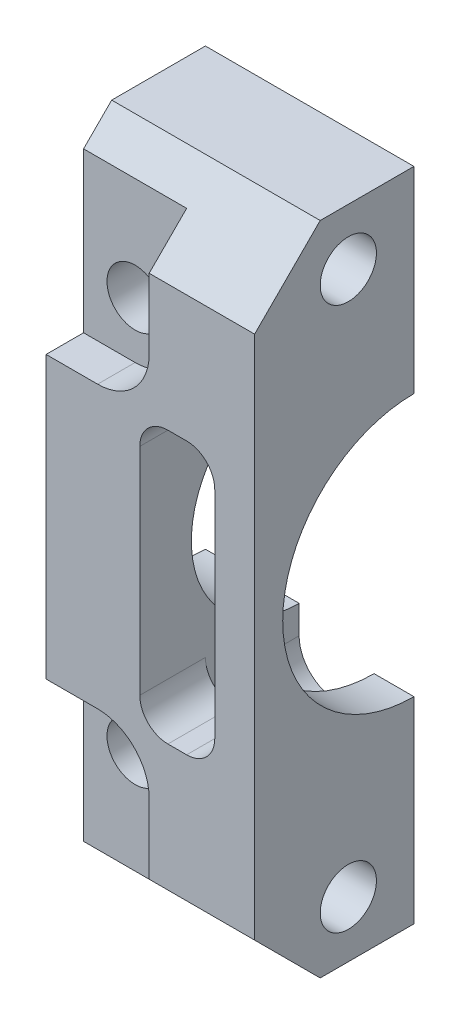
ISO-10303-21;
HEADER;
FILE_DESCRIPTION(('STEP AP214'),'2;1');
FILE_NAME('part.step','',(''),(''),'','','');
FILE_SCHEMA(('AUTOMOTIVE_DESIGN { 1 0 10303 214 1 1 1 1 }'));
ENDSEC;
DATA;
#1=APPLICATION_CONTEXT('core data for automotive mechanical design processes');
#2=APPLICATION_PROTOCOL_DEFINITION('international standard','automotive_design',2000,#1);
#3=PRODUCT_CONTEXT('',#1,'mechanical');
#4=PRODUCT('Part','Part','',(#3));
#5=PRODUCT_RELATED_PRODUCT_CATEGORY('part','',(#4));
#6=PRODUCT_DEFINITION_FORMATION('','',#4);
#7=PRODUCT_DEFINITION_CONTEXT('part definition',#1,'design');
#8=PRODUCT_DEFINITION('design','',#6,#7);
#9=PRODUCT_DEFINITION_SHAPE('','',#8);
#10=(LENGTH_UNIT() NAMED_UNIT(*) SI_UNIT(.MILLI.,.METRE.));
#11=(NAMED_UNIT(*) PLANE_ANGLE_UNIT() SI_UNIT($,.RADIAN.));
#12=(NAMED_UNIT(*) SI_UNIT($,.STERADIAN.) SOLID_ANGLE_UNIT());
#13=UNCERTAINTY_MEASURE_WITH_UNIT(LENGTH_MEASURE(1.E-05),#10,'distance_accuracy_value','');
#14=(GEOMETRIC_REPRESENTATION_CONTEXT(3) GLOBAL_UNCERTAINTY_ASSIGNED_CONTEXT((#13)) GLOBAL_UNIT_ASSIGNED_CONTEXT((#10,
#11,#12)) REPRESENTATION_CONTEXT('',''));
#15=CARTESIAN_POINT('',(0.,0.,0.));
#16=DIRECTION('',(0.,0.,1.));
#17=DIRECTION('',(1.,0.,0.));
#18=AXIS2_PLACEMENT_3D('',#15,#16,#17);
#19=CARTESIAN_POINT('',(10.,0.,0.));
#20=DIRECTION('',(1.,0.,0.));
#21=DIRECTION('',(0.,0.,-1.));
#22=AXIS2_PLACEMENT_3D('',#19,#20,#21);
#23=PLANE('',#22);
#24=DIRECTION('',(0.,0.,-1.));
#25=VECTOR('',#24,1.);
#26=CARTESIAN_POINT('',(10.,14.5,10.));
#27=LINE('',#26,#25);
#28=CARTESIAN_POINT('',(10.,14.5,10.));
#29=VERTEX_POINT('',#28);
#30=CARTESIAN_POINT('',(10.,14.5,0.));
#31=VERTEX_POINT('',#30);
#32=EDGE_CURVE('E502',#29,#31,#27,.T.);
#33=ORIENTED_EDGE('',*,*,#32,.F.);
#34=DIRECTION('',(0.,-1.,0.));
#35=VECTOR('',#34,1.);
#36=CARTESIAN_POINT('',(10.,-14.5,9.99999999999999));
#37=LINE('',#36,#35);
#38=CARTESIAN_POINT('',(10.,11.5,10.));
#39=VERTEX_POINT('',#38);
#40=EDGE_CURVE('E350',#29,#39,#37,.T.);
#41=ORIENTED_EDGE('',*,*,#40,.T.);
#42=DIRECTION('',(0.,0.,-1.));
#43=VECTOR('',#42,1.);
#44=CARTESIAN_POINT('',(10.,11.5,0.));
#45=LINE('',#44,#43);
#46=CARTESIAN_POINT('',(10.,11.5,17.));
#47=VERTEX_POINT('',#46);
#48=EDGE_CURVE('E348',#39,#47,#45,.F.);
#49=ORIENTED_EDGE('',*,*,#48,.T.);
#50=DIRECTION('',(0.,1.,0.));
#51=VECTOR('',#50,1.);
#52=CARTESIAN_POINT('',(10.,45.,17.));
#53=LINE('',#52,#51);
#54=CARTESIAN_POINT('',(10.,-11.5,17.));
#55=VERTEX_POINT('',#54);
#56=EDGE_CURVE('E471',#55,#47,#53,.T.);
#57=ORIENTED_EDGE('',*,*,#56,.F.);
#58=DIRECTION('',(0.,0.,-1.));
#59=VECTOR('',#58,1.);
#60=CARTESIAN_POINT('',(10.,-11.5,0.));
#61=LINE('',#60,#59);
#62=CARTESIAN_POINT('',(10.,-11.5,9.99999999999999));
#63=VERTEX_POINT('',#62);
#64=EDGE_CURVE('E345',#55,#63,#61,.T.);
#65=ORIENTED_EDGE('',*,*,#64,.T.);
#66=DIRECTION('',(0.,-1.,0.));
#67=VECTOR('',#66,1.);
#68=CARTESIAN_POINT('',(10.,-14.5,9.99999999999999));
#69=LINE('',#68,#67);
#70=CARTESIAN_POINT('',(10.,-14.5,9.99999999999999));
#71=VERTEX_POINT('',#70);
#72=EDGE_CURVE('E343',#63,#71,#69,.T.);
#73=ORIENTED_EDGE('',*,*,#72,.T.);
#74=DIRECTION('',(0.,0.,-1.));
#75=VECTOR('',#74,1.);
#76=CARTESIAN_POINT('',(10.,-14.5,9.99999999999999));
#77=LINE('',#76,#75);
#78=CARTESIAN_POINT('',(10.,-14.5,0.));
#79=VERTEX_POINT('',#78);
#80=EDGE_CURVE('E488',#71,#79,#77,.T.);
#81=ORIENTED_EDGE('',*,*,#80,.T.);
#82=DIRECTION('',(0.,1.,0.));
#83=VECTOR('',#82,1.);
#84=CARTESIAN_POINT('',(10.,-11.5,0.));
#85=LINE('',#84,#83);
#86=CARTESIAN_POINT('',(10.,-11.5,0.));
#87=VERTEX_POINT('',#86);
#88=EDGE_CURVE('E298',#79,#87,#85,.T.);
#89=ORIENTED_EDGE('',*,*,#88,.T.);
#90=CARTESIAN_POINT('',(10.,0.,0.));
#91=DIRECTION('',(-1.,0.,0.));
#92=DIRECTION('',(0.,0.,-1.));
#93=AXIS2_PLACEMENT_3D('',#90,#91,#92);
#94=CIRCLE('',#93,11.5);
#95=CARTESIAN_POINT('',(10.,11.5,0.));
#96=VERTEX_POINT('',#95);
#97=EDGE_CURVE('E293',#87,#96,#94,.T.);
#98=ORIENTED_EDGE('',*,*,#97,.T.);
#99=DIRECTION('',(0.,1.,0.));
#100=VECTOR('',#99,1.);
#101=CARTESIAN_POINT('',(10.,11.5,0.));
#102=LINE('',#101,#100);
#103=EDGE_CURVE('E295',#96,#31,#102,.T.);
#104=ORIENTED_EDGE('',*,*,#103,.T.);
#105=EDGE_LOOP('',(#33,#41,#49,#57,#65,#73,#81,#89,#98,#104));
#106=FACE_BOUND('',#105,.T.);
#107=ADVANCED_FACE('F39',(#106),#23,.T.);
#108=CARTESIAN_POINT('',(10.,0.,0.));
#109=DIRECTION('',(-1.,0.,0.));
#110=DIRECTION('',(0.,0.,1.));
#111=AXIS2_PLACEMENT_3D('',#108,#109,#110);
#112=CYLINDRICAL_SURFACE('',#111,11.5);
#113=CARTESIAN_POINT('',(0.,0.,0.));
#114=DIRECTION('',(-1.,0.,0.));
#115=DIRECTION('',(0.,0.,-1.));
#116=AXIS2_PLACEMENT_3D('',#113,#114,#115);
#117=CIRCLE('',#116,11.5);
#118=CARTESIAN_POINT('',(0.,-11.5,0.));
#119=VERTEX_POINT('',#118);
#120=CARTESIAN_POINT('',(0.,11.5,0.));
#121=VERTEX_POINT('',#120);
#122=EDGE_CURVE('E292',#119,#121,#117,.T.);
#123=ORIENTED_EDGE('',*,*,#122,.T.);
#124=DIRECTION('',(-1.,0.,0.));
#125=VECTOR('',#124,1.);
#126=CARTESIAN_POINT('',(10.,11.5,0.));
#127=LINE('',#126,#125);
#128=EDGE_CURVE('E319',#96,#121,#127,.T.);
#129=ORIENTED_EDGE('',*,*,#128,.F.);
#130=ORIENTED_EDGE('',*,*,#97,.F.);
#131=DIRECTION('',(-1.,0.,0.));
#132=VECTOR('',#131,1.);
#133=CARTESIAN_POINT('',(10.,-11.5,0.));
#134=LINE('',#133,#132);
#135=EDGE_CURVE('E300',#87,#119,#134,.T.);
#136=ORIENTED_EDGE('',*,*,#135,.T.);
#137=EDGE_LOOP('',(#123,#129,#130,#136));
#138=FACE_BOUND('',#137,.T.);
#139=ADVANCED_FACE('F530',(#138),#112,.F.);
#140=CARTESIAN_POINT('',(10.,11.5,0.));
#141=DIRECTION('',(0.,0.,1.));
#142=DIRECTION('',(0.,-1.,0.));
#143=AXIS2_PLACEMENT_3D('',#140,#141,#142);
#144=PLANE('',#143);
#145=CARTESIAN_POINT('',(5.5,21.,0.));
#146=DIRECTION('',(0.,0.,-1.));
#147=DIRECTION('',(0.,1.,0.));
#148=AXIS2_PLACEMENT_3D('',#145,#146,#147);
#149=CIRCLE('',#148,3.);
#150=CARTESIAN_POINT('',(5.5,24.,0.));
#151=VERTEX_POINT('',#150);
#152=EDGE_CURVE('E381',#151,#151,#149,.T.);
#153=ORIENTED_EDGE('',*,*,#152,.F.);
#154=EDGE_LOOP('',(#153));
#155=FACE_BOUND('',#154,.T.);
#156=DIRECTION('',(-1.,0.,0.));
#157=VECTOR('',#156,1.);
#158=CARTESIAN_POINT('',(22.25,14.,0.));
#159=LINE('',#158,#157);
#160=CARTESIAN_POINT('',(22.25,14.,0.));
#161=VERTEX_POINT('',#160);
#162=CARTESIAN_POINT('',(18.,14.,0.));
#163=VERTEX_POINT('',#162);
#164=EDGE_CURVE('E289',#161,#163,#159,.T.);
#165=ORIENTED_EDGE('',*,*,#164,.T.);
#166=DIRECTION('',(0.,-1.,0.));
#167=VECTOR('',#166,1.);
#168=CARTESIAN_POINT('',(18.,-14.5,0.));
#169=LINE('',#168,#167);
#170=CARTESIAN_POINT('',(18.,14.5,0.));
#171=VERTEX_POINT('',#170);
#172=EDGE_CURVE('E485',#171,#163,#169,.T.);
#173=ORIENTED_EDGE('',*,*,#172,.F.);
#174=CARTESIAN_POINT('',(14.,14.5,0.));
#175=DIRECTION('',(0.,0.,-1.));
#176=DIRECTION('',(0.,1.,0.));
#177=AXIS2_PLACEMENT_3D('',#174,#175,#176);
#178=CIRCLE('',#177,4.);
#179=EDGE_CURVE('E491',#31,#171,#178,.T.);
#180=ORIENTED_EDGE('',*,*,#179,.F.);
#181=ORIENTED_EDGE('',*,*,#103,.F.);
#182=ORIENTED_EDGE('',*,*,#128,.T.);
#183=DIRECTION('',(0.,1.,0.));
#184=VECTOR('',#183,1.);
#185=CARTESIAN_POINT('',(0.,11.5,0.));
#186=LINE('',#185,#184);
#187=CARTESIAN_POINT('',(0.,35.,0.));
#188=VERTEX_POINT('',#187);
#189=EDGE_CURVE('E303',#121,#188,#186,.T.);
#190=ORIENTED_EDGE('',*,*,#189,.T.);
#191=DIRECTION('',(-1.,0.,0.));
#192=VECTOR('',#191,1.);
#193=CARTESIAN_POINT('',(10.,35.,0.));
#194=LINE('',#193,#192);
#195=CARTESIAN_POINT('',(22.25,35.,0.));
#196=VERTEX_POINT('',#195);
#197=EDGE_CURVE('E316',#196,#188,#194,.T.);
#198=ORIENTED_EDGE('',*,*,#197,.F.);
#199=DIRECTION('',(0.,1.,0.));
#200=VECTOR('',#199,1.);
#201=CARTESIAN_POINT('',(22.25,35.,0.));
#202=LINE('',#201,#200);
#203=EDGE_CURVE('E270',#161,#196,#202,.T.);
#204=ORIENTED_EDGE('',*,*,#203,.F.);
#205=EDGE_LOOP('',(#165,#173,#180,#181,#182,#190,#198,#204));
#206=FACE_BOUND('',#205,.T.);
#207=ADVANCED_FACE('F432',(#155,#206),#144,.F.);
#208=CARTESIAN_POINT('',(10.,35.,25.));
#209=DIRECTION('',(0.,-1.,0.));
#210=DIRECTION('',(0.,0.,-1.));
#211=AXIS2_PLACEMENT_3D('',#208,#209,#210);
#212=PLANE('',#211);
#213=DIRECTION('',(0.,0.,1.));
#214=VECTOR('',#213,1.);
#215=CARTESIAN_POINT('',(0.,35.,25.));
#216=LINE('',#215,#214);
#217=CARTESIAN_POINT('',(0.,35.,10.));
#218=VERTEX_POINT('',#217);
#219=EDGE_CURVE('E305',#188,#218,#216,.T.);
#220=ORIENTED_EDGE('',*,*,#219,.T.);
#221=DIRECTION('',(1.,0.,0.));
#222=VECTOR('',#221,1.);
#223=CARTESIAN_POINT('',(10.,35.,10.));
#224=LINE('',#223,#222);
#225=CARTESIAN_POINT('',(22.25,35.,10.));
#226=VERTEX_POINT('',#225);
#227=EDGE_CURVE('E417',#218,#226,#224,.T.);
#228=ORIENTED_EDGE('',*,*,#227,.T.);
#229=DIRECTION('',(0.,0.,1.));
#230=VECTOR('',#229,1.);
#231=CARTESIAN_POINT('',(22.25,35.,25.));
#232=LINE('',#231,#230);
#233=EDGE_CURVE('E279',#196,#226,#232,.T.);
#234=ORIENTED_EDGE('',*,*,#233,.F.);
#235=ORIENTED_EDGE('',*,*,#197,.T.);
#236=EDGE_LOOP('',(#220,#228,#234,#235));
#237=FACE_BOUND('',#236,.T.);
#238=ADVANCED_FACE('F422',(#237),#212,.F.);
#239=CARTESIAN_POINT('',(10.,-35.,0.));
#240=DIRECTION('',(0.,1.,0.));
#241=DIRECTION('',(0.,0.,1.));
#242=AXIS2_PLACEMENT_3D('',#239,#240,#241);
#243=PLANE('',#242);
#244=DIRECTION('',(0.,0.,-1.));
#245=VECTOR('',#244,1.);
#246=CARTESIAN_POINT('',(22.25,-35.,0.));
#247=LINE('',#246,#245);
#248=CARTESIAN_POINT('',(22.25,-35.,9.99999999999997));
#249=VERTEX_POINT('',#248);
#250=CARTESIAN_POINT('',(22.25,-35.,0.));
#251=VERTEX_POINT('',#250);
#252=EDGE_CURVE('E282',#249,#251,#247,.T.);
#253=ORIENTED_EDGE('',*,*,#252,.F.);
#254=DIRECTION('',(-1.,0.,0.));
#255=VECTOR('',#254,1.);
#256=CARTESIAN_POINT('',(10.,-35.,9.99999999999997));
#257=LINE('',#256,#255);
#258=CARTESIAN_POINT('',(0.,-35.,9.99999999999997));
#259=VERTEX_POINT('',#258);
#260=EDGE_CURVE('E408',#249,#259,#257,.T.);
#261=ORIENTED_EDGE('',*,*,#260,.T.);
#262=DIRECTION('',(0.,0.,-1.));
#263=VECTOR('',#262,1.);
#264=CARTESIAN_POINT('',(0.,-35.,0.));
#265=LINE('',#264,#263);
#266=CARTESIAN_POINT('',(0.,-35.,0.));
#267=VERTEX_POINT('',#266);
#268=EDGE_CURVE('E308',#259,#267,#265,.T.);
#269=ORIENTED_EDGE('',*,*,#268,.T.);
#270=DIRECTION('',(-1.,0.,0.));
#271=VECTOR('',#270,1.);
#272=CARTESIAN_POINT('',(10.,-35.,0.));
#273=LINE('',#272,#271);
#274=EDGE_CURVE('E313',#251,#267,#273,.T.);
#275=ORIENTED_EDGE('',*,*,#274,.F.);
#276=EDGE_LOOP('',(#253,#261,#269,#275));
#277=FACE_BOUND('',#276,.T.);
#278=ADVANCED_FACE('F549',(#277),#243,.F.);
#279=CARTESIAN_POINT('',(10.,-11.5,0.));
#280=DIRECTION('',(0.,0.,1.));
#281=DIRECTION('',(0.,-1.,0.));
#282=AXIS2_PLACEMENT_3D('',#279,#280,#281);
#283=PLANE('',#282);
#284=CARTESIAN_POINT('',(5.5,-21.,0.));
#285=DIRECTION('',(0.,0.,-1.));
#286=DIRECTION('',(0.,1.,0.));
#287=AXIS2_PLACEMENT_3D('',#284,#285,#286);
#288=CIRCLE('',#287,3.);
#289=CARTESIAN_POINT('',(5.5,-18.,0.));
#290=VERTEX_POINT('',#289);
#291=EDGE_CURVE('E457',#290,#290,#288,.T.);
#292=ORIENTED_EDGE('',*,*,#291,.F.);
#293=EDGE_LOOP('',(#292));
#294=FACE_BOUND('',#293,.T.);
#295=CARTESIAN_POINT('',(14.,-14.5,0.));
#296=DIRECTION('',(0.,0.,-1.));
#297=DIRECTION('',(0.,1.,0.));
#298=AXIS2_PLACEMENT_3D('',#295,#296,#297);
#299=CIRCLE('',#298,4.);
#300=CARTESIAN_POINT('',(18.,-14.5,0.));
#301=VERTEX_POINT('',#300);
#302=EDGE_CURVE('E480',#301,#79,#299,.T.);
#303=ORIENTED_EDGE('',*,*,#302,.F.);
#304=CARTESIAN_POINT('',(18.,-14.,0.));
#305=VERTEX_POINT('',#304);
#306=EDGE_CURVE('E494',#305,#301,#169,.T.);
#307=ORIENTED_EDGE('',*,*,#306,.F.);
#308=DIRECTION('',(-1.,0.,0.));
#309=VECTOR('',#308,1.);
#310=CARTESIAN_POINT('',(22.25,-14.,0.));
#311=LINE('',#310,#309);
#312=CARTESIAN_POINT('',(22.25,-14.,0.));
#313=VERTEX_POINT('',#312);
#314=EDGE_CURVE('E286',#313,#305,#311,.T.);
#315=ORIENTED_EDGE('',*,*,#314,.F.);
#316=DIRECTION('',(0.,1.,0.));
#317=VECTOR('',#316,1.);
#318=CARTESIAN_POINT('',(22.25,-14.,0.));
#319=LINE('',#318,#317);
#320=EDGE_CURVE('E284',#251,#313,#319,.T.);
#321=ORIENTED_EDGE('',*,*,#320,.F.);
#322=ORIENTED_EDGE('',*,*,#274,.T.);
#323=DIRECTION('',(0.,1.,0.));
#324=VECTOR('',#323,1.);
#325=CARTESIAN_POINT('',(0.,-11.5,0.));
#326=LINE('',#325,#324);
#327=EDGE_CURVE('E296',#267,#119,#326,.T.);
#328=ORIENTED_EDGE('',*,*,#327,.T.);
#329=ORIENTED_EDGE('',*,*,#135,.F.);
#330=ORIENTED_EDGE('',*,*,#88,.F.);
#331=EDGE_LOOP('',(#303,#307,#315,#321,#322,#328,#329,#330));
#332=FACE_BOUND('',#331,.T.);
#333=ADVANCED_FACE('F545',(#294,#332),#283,.F.);
#334=CARTESIAN_POINT('',(0.,0.,0.));
#335=DIRECTION('',(1.,0.,0.));
#336=DIRECTION('',(0.,0.,-1.));
#337=AXIS2_PLACEMENT_3D('',#334,#335,#336);
#338=PLANE('',#337);
#339=CARTESIAN_POINT('',(0.,-29.,6.99999999999999));
#340=DIRECTION('',(1.,0.,0.));
#341=DIRECTION('',(0.,0.,-1.));
#342=AXIS2_PLACEMENT_3D('',#339,#340,#341);
#343=CIRCLE('',#342,3.);
#344=CARTESIAN_POINT('',(0.,-29.,3.99999999999999));
#345=VERTEX_POINT('',#344);
#346=EDGE_CURVE('E267',#345,#345,#343,.T.);
#347=ORIENTED_EDGE('',*,*,#346,.T.);
#348=EDGE_LOOP('',(#347));
#349=FACE_BOUND('',#348,.T.);
#350=CARTESIAN_POINT('',(0.,29.,6.99999999999999));
#351=DIRECTION('',(1.,0.,0.));
#352=DIRECTION('',(0.,0.,-1.));
#353=AXIS2_PLACEMENT_3D('',#350,#351,#352);
#354=CIRCLE('',#353,3.);
#355=CARTESIAN_POINT('',(0.,29.,3.99999999999999));
#356=VERTEX_POINT('',#355);
#357=EDGE_CURVE('E273',#356,#356,#354,.T.);
#358=ORIENTED_EDGE('',*,*,#357,.T.);
#359=EDGE_LOOP('',(#358));
#360=FACE_BOUND('',#359,.T.);
#361=ORIENTED_EDGE('',*,*,#268,.F.);
#362=DIRECTION('',(0.,-0.707106781186545,-0.70710678118655));
#363=VECTOR('',#362,1.);
#364=CARTESIAN_POINT('',(0.,-28.,17.));
#365=LINE('',#364,#363);
#366=CARTESIAN_POINT('',(0.,-32.,13.));
#367=VERTEX_POINT('',#366);
#368=EDGE_CURVE('E412',#259,#367,#365,.F.);
#369=ORIENTED_EDGE('',*,*,#368,.T.);
#370=DIRECTION('',(0.,-1.,0.));
#371=VECTOR('',#370,1.);
#372=CARTESIAN_POINT('',(0.,-35.,13.));
#373=LINE('',#372,#371);
#374=CARTESIAN_POINT('',(0.,-15.,13.));
#375=VERTEX_POINT('',#374);
#376=EDGE_CURVE('E259',#375,#367,#373,.T.);
#377=ORIENTED_EDGE('',*,*,#376,.F.);
#378=DIRECTION('',(0.,0.,-1.));
#379=VECTOR('',#378,1.);
#380=CARTESIAN_POINT('',(0.,-15.,17.));
#381=LINE('',#380,#379);
#382=CARTESIAN_POINT('',(0.,-15.,17.));
#383=VERTEX_POINT('',#382);
#384=EDGE_CURVE('E242',#383,#375,#381,.T.);
#385=ORIENTED_EDGE('',*,*,#384,.F.);
#386=DIRECTION('',(0.,-1.,0.));
#387=VECTOR('',#386,1.);
#388=CARTESIAN_POINT('',(0.,45.,17.));
#389=LINE('',#388,#387);
#390=CARTESIAN_POINT('',(0.,15.,17.));
#391=VERTEX_POINT('',#390);
#392=EDGE_CURVE('E258',#391,#383,#389,.T.);
#393=ORIENTED_EDGE('',*,*,#392,.F.);
#394=DIRECTION('',(0.,0.,1.));
#395=VECTOR('',#394,1.);
#396=CARTESIAN_POINT('',(0.,15.,17.));
#397=LINE('',#396,#395);
#398=CARTESIAN_POINT('',(0.,15.,13.));
#399=VERTEX_POINT('',#398);
#400=EDGE_CURVE('E451',#399,#391,#397,.T.);
#401=ORIENTED_EDGE('',*,*,#400,.F.);
#402=DIRECTION('',(0.,-1.,0.));
#403=VECTOR('',#402,1.);
#404=CARTESIAN_POINT('',(0.,35.,13.));
#405=LINE('',#404,#403);
#406=CARTESIAN_POINT('',(0.,32.,13.));
#407=VERTEX_POINT('',#406);
#408=EDGE_CURVE('E436',#407,#399,#405,.T.);
#409=ORIENTED_EDGE('',*,*,#408,.F.);
#410=DIRECTION('',(0.,-0.707106781186549,0.707106781186546));
#411=VECTOR('',#410,1.);
#412=CARTESIAN_POINT('',(0.,35.,10.));
#413=LINE('',#412,#411);
#414=EDGE_CURVE('E410',#407,#218,#413,.F.);
#415=ORIENTED_EDGE('',*,*,#414,.T.);
#416=ORIENTED_EDGE('',*,*,#219,.F.);
#417=ORIENTED_EDGE('',*,*,#189,.F.);
#418=ORIENTED_EDGE('',*,*,#122,.F.);
#419=ORIENTED_EDGE('',*,*,#327,.F.);
#420=EDGE_LOOP('',(#361,#369,#377,#385,#393,#401,#409,#415,#416,#417,#418,#419));
#421=FACE_BOUND('',#420,.T.);
#422=ADVANCED_FACE('F256',(#349,#360,#421),#338,.F.);
#423=CARTESIAN_POINT('',(22.25,0.,0.));
#424=DIRECTION('',(-1.,0.,0.));
#425=DIRECTION('',(0.,0.,1.));
#426=AXIS2_PLACEMENT_3D('',#423,#424,#425);
#427=CYLINDRICAL_SURFACE('',#426,14.);
#428=ORIENTED_EDGE('',*,*,#314,.T.);
#429=CARTESIAN_POINT('',(18.,0.,0.));
#430=DIRECTION('',(1.,0.,0.));
#431=DIRECTION('',(0.,0.,-1.));
#432=AXIS2_PLACEMENT_3D('',#429,#430,#431);
#433=CIRCLE('',#432,14.);
#434=EDGE_CURVE('E325',#305,#163,#433,.F.);
#435=ORIENTED_EDGE('',*,*,#434,.T.);
#436=ORIENTED_EDGE('',*,*,#164,.F.);
#437=CARTESIAN_POINT('',(22.25,0.,0.));
#438=DIRECTION('',(-1.,0.,0.));
#439=DIRECTION('',(0.,0.,-1.));
#440=AXIS2_PLACEMENT_3D('',#437,#438,#439);
#441=CIRCLE('',#440,14.);
#442=EDGE_CURVE('E266',#313,#161,#441,.T.);
#443=ORIENTED_EDGE('',*,*,#442,.F.);
#444=EDGE_LOOP('',(#428,#435,#436,#443));
#445=FACE_BOUND('',#444,.T.);
#446=ADVANCED_FACE('F541',(#445),#427,.F.);
#447=CARTESIAN_POINT('',(22.25,0.,0.));
#448=DIRECTION('',(1.,0.,0.));
#449=DIRECTION('',(0.,0.,-1.));
#450=AXIS2_PLACEMENT_3D('',#447,#448,#449);
#451=PLANE('',#450);
#452=CARTESIAN_POINT('',(22.25,-29.,6.99999999999999));
#453=DIRECTION('',(1.,0.,0.));
#454=DIRECTION('',(0.,0.,-1.));
#455=AXIS2_PLACEMENT_3D('',#452,#453,#454);
#456=CIRCLE('',#455,3.);
#457=CARTESIAN_POINT('',(22.25,-29.,3.99999999999999));
#458=VERTEX_POINT('',#457);
#459=EDGE_CURVE('E507',#458,#458,#456,.T.);
#460=ORIENTED_EDGE('',*,*,#459,.F.);
#461=EDGE_LOOP('',(#460));
#462=FACE_BOUND('',#461,.T.);
#463=CARTESIAN_POINT('',(22.25,29.,6.99999999999999));
#464=DIRECTION('',(1.,0.,0.));
#465=DIRECTION('',(0.,0.,-1.));
#466=AXIS2_PLACEMENT_3D('',#463,#464,#465);
#467=CIRCLE('',#466,3.);
#468=CARTESIAN_POINT('',(22.25,29.,3.99999999999999));
#469=VERTEX_POINT('',#468);
#470=EDGE_CURVE('E499',#469,#469,#467,.T.);
#471=ORIENTED_EDGE('',*,*,#470,.F.);
#472=EDGE_LOOP('',(#471));
#473=FACE_BOUND('',#472,.T.);
#474=DIRECTION('',(0.,1.,0.));
#475=VECTOR('',#474,1.);
#476=CARTESIAN_POINT('',(22.25,0.,17.));
#477=LINE('',#476,#475);
#478=CARTESIAN_POINT('',(22.25,-28.,17.));
#479=VERTEX_POINT('',#478);
#480=CARTESIAN_POINT('',(22.25,28.,17.));
#481=VERTEX_POINT('',#480);
#482=EDGE_CURVE('E322',#479,#481,#477,.T.);
#483=ORIENTED_EDGE('',*,*,#482,.F.);
#484=DIRECTION('',(0.,0.707106781186545,0.70710678118655));
#485=VECTOR('',#484,1.);
#486=CARTESIAN_POINT('',(22.25,-22.5000000000001,22.5));
#487=LINE('',#486,#485);
#488=EDGE_CURVE('E406',#479,#249,#487,.F.);
#489=ORIENTED_EDGE('',*,*,#488,.T.);
#490=ORIENTED_EDGE('',*,*,#252,.T.);
#491=ORIENTED_EDGE('',*,*,#320,.T.);
#492=ORIENTED_EDGE('',*,*,#442,.T.);
#493=ORIENTED_EDGE('',*,*,#203,.T.);
#494=ORIENTED_EDGE('',*,*,#233,.T.);
#495=DIRECTION('',(0.,0.707106781186549,-0.707106781186546));
#496=VECTOR('',#495,1.);
#497=CARTESIAN_POINT('',(22.25,22.4999999999999,22.5));
#498=LINE('',#497,#496);
#499=EDGE_CURVE('E404',#226,#481,#498,.F.);
#500=ORIENTED_EDGE('',*,*,#499,.T.);
#501=EDGE_LOOP('',(#483,#489,#490,#491,#492,#493,#494,#500));
#502=FACE_BOUND('',#501,.T.);
#503=ADVANCED_FACE('F428',(#462,#473,#502),#451,.T.);
#504=CARTESIAN_POINT('',(0.,45.,17.));
#505=DIRECTION('',(0.,0.,-1.));
#506=DIRECTION('',(-1.,0.,0.));
#507=AXIS2_PLACEMENT_3D('',#504,#505,#506);
#508=PLANE('',#507);
#509=ORIENTED_EDGE('',*,*,#56,.T.);
#510=CARTESIAN_POINT('',(13.,11.5,17.));
#511=DIRECTION('',(0.,0.,-1.));
#512=DIRECTION('',(-1.,0.,0.));
#513=AXIS2_PLACEMENT_3D('',#510,#511,#512);
#514=CIRCLE('',#513,3.);
#515=CARTESIAN_POINT('',(13.,14.5,17.));
#516=VERTEX_POINT('',#515);
#517=EDGE_CURVE('E364',#47,#516,#514,.T.);
#518=ORIENTED_EDGE('',*,*,#517,.T.);
#519=DIRECTION('',(1.,0.,0.));
#520=VECTOR('',#519,1.);
#521=CARTESIAN_POINT('',(0.,14.5,17.));
#522=LINE('',#521,#520);
#523=CARTESIAN_POINT('',(15.,14.5,17.));
#524=VERTEX_POINT('',#523);
#525=EDGE_CURVE('E477',#516,#524,#522,.T.);
#526=ORIENTED_EDGE('',*,*,#525,.T.);
#527=CARTESIAN_POINT('',(15.,11.5,17.));
#528=DIRECTION('',(0.,0.,-1.));
#529=DIRECTION('',(-1.,0.,0.));
#530=AXIS2_PLACEMENT_3D('',#527,#528,#529);
#531=CIRCLE('',#530,3.);
#532=CARTESIAN_POINT('',(18.,11.5,17.));
#533=VERTEX_POINT('',#532);
#534=EDGE_CURVE('E360',#524,#533,#531,.T.);
#535=ORIENTED_EDGE('',*,*,#534,.T.);
#536=DIRECTION('',(0.,-1.,0.));
#537=VECTOR('',#536,1.);
#538=CARTESIAN_POINT('',(18.,45.,17.));
#539=LINE('',#538,#537);
#540=CARTESIAN_POINT('',(18.,-11.5,17.));
#541=VERTEX_POINT('',#540);
#542=EDGE_CURVE('E474',#533,#541,#539,.T.);
#543=ORIENTED_EDGE('',*,*,#542,.T.);
#544=CARTESIAN_POINT('',(15.,-11.5,17.));
#545=DIRECTION('',(0.,0.,-1.));
#546=DIRECTION('',(-1.,0.,0.));
#547=AXIS2_PLACEMENT_3D('',#544,#545,#546);
#548=CIRCLE('',#547,3.);
#549=CARTESIAN_POINT('',(15.,-14.5,17.));
#550=VERTEX_POINT('',#549);
#551=EDGE_CURVE('E372',#541,#550,#548,.T.);
#552=ORIENTED_EDGE('',*,*,#551,.T.);
#553=DIRECTION('',(-1.,0.,0.));
#554=VECTOR('',#553,1.);
#555=CARTESIAN_POINT('',(0.,-14.5,17.));
#556=LINE('',#555,#554);
#557=CARTESIAN_POINT('',(13.,-14.5,17.));
#558=VERTEX_POINT('',#557);
#559=EDGE_CURVE('E468',#550,#558,#556,.T.);
#560=ORIENTED_EDGE('',*,*,#559,.T.);
#561=CARTESIAN_POINT('',(13.,-11.5,17.));
#562=DIRECTION('',(0.,0.,-1.));
#563=DIRECTION('',(-1.,0.,0.));
#564=AXIS2_PLACEMENT_3D('',#561,#562,#563);
#565=CIRCLE('',#564,3.);
#566=EDGE_CURVE('E368',#558,#55,#565,.T.);
#567=ORIENTED_EDGE('',*,*,#566,.T.);
#568=EDGE_LOOP('',(#509,#518,#526,#535,#543,#552,#560,#567));
#569=FACE_BOUND('',#568,.T.);
#570=DIRECTION('',(0.,1.,0.));
#571=VECTOR('',#570,1.);
#572=CARTESIAN_POINT('',(11.,-35.,17.));
#573=LINE('',#572,#571);
#574=CARTESIAN_POINT('',(11.,-28.,17.));
#575=VERTEX_POINT('',#574);
#576=CARTESIAN_POINT('',(11.,-20.5,17.));
#577=VERTEX_POINT('',#576);
#578=EDGE_CURVE('E600',#575,#577,#573,.T.);
#579=ORIENTED_EDGE('',*,*,#578,.F.);
#580=DIRECTION('',(1.,0.,0.));
#581=VECTOR('',#580,1.);
#582=CARTESIAN_POINT('',(0.,-28.,17.));
#583=LINE('',#582,#581);
#584=EDGE_CURVE('E401',#575,#479,#583,.T.);
#585=ORIENTED_EDGE('',*,*,#584,.T.);
#586=ORIENTED_EDGE('',*,*,#482,.T.);
#587=DIRECTION('',(-1.,0.,0.));
#588=VECTOR('',#587,1.);
#589=CARTESIAN_POINT('',(0.,28.,17.));
#590=LINE('',#589,#588);
#591=CARTESIAN_POINT('',(11.,28.,17.));
#592=VERTEX_POINT('',#591);
#593=EDGE_CURVE('E399',#481,#592,#590,.T.);
#594=ORIENTED_EDGE('',*,*,#593,.T.);
#595=DIRECTION('',(0.,1.,0.));
#596=VECTOR('',#595,1.);
#597=CARTESIAN_POINT('',(11.,35.,17.));
#598=LINE('',#597,#596);
#599=CARTESIAN_POINT('',(11.,20.5,17.));
#600=VERTEX_POINT('',#599);
#601=EDGE_CURVE('E448',#600,#592,#598,.T.);
#602=ORIENTED_EDGE('',*,*,#601,.F.);
#603=CARTESIAN_POINT('',(5.5,20.5,17.));
#604=DIRECTION('',(0.,0.,-1.));
#605=DIRECTION('',(-1.,0.,0.));
#606=AXIS2_PLACEMENT_3D('',#603,#604,#605);
#607=CIRCLE('',#606,5.5);
#608=CARTESIAN_POINT('',(5.5,15.,17.));
#609=VERTEX_POINT('',#608);
#610=EDGE_CURVE('E397',#600,#609,#607,.T.);
#611=ORIENTED_EDGE('',*,*,#610,.T.);
#612=DIRECTION('',(-1.,0.,0.));
#613=VECTOR('',#612,1.);
#614=CARTESIAN_POINT('',(11.,15.,17.));
#615=LINE('',#614,#613);
#616=EDGE_CURVE('E260',#609,#391,#615,.T.);
#617=ORIENTED_EDGE('',*,*,#616,.T.);
#618=ORIENTED_EDGE('',*,*,#392,.T.);
#619=DIRECTION('',(-1.,0.,0.));
#620=VECTOR('',#619,1.);
#621=CARTESIAN_POINT('',(11.,-15.,17.));
#622=LINE('',#621,#620);
#623=CARTESIAN_POINT('',(5.5,-15.,17.));
#624=VERTEX_POINT('',#623);
#625=EDGE_CURVE('E238',#624,#383,#622,.T.);
#626=ORIENTED_EDGE('',*,*,#625,.F.);
#627=CARTESIAN_POINT('',(5.5,-20.5,17.));
#628=DIRECTION('',(0.,0.,-1.));
#629=DIRECTION('',(-1.,0.,0.));
#630=AXIS2_PLACEMENT_3D('',#627,#628,#629);
#631=CIRCLE('',#630,5.5);
#632=EDGE_CURVE('E395',#624,#577,#631,.T.);
#633=ORIENTED_EDGE('',*,*,#632,.T.);
#634=EDGE_LOOP('',(#579,#585,#586,#594,#602,#611,#617,#618,#626,#633));
#635=FACE_BOUND('',#634,.T.);
#636=ADVANCED_FACE('F263',(#569,#635),#508,.F.);
#637=CARTESIAN_POINT('',(-2.75,29.,6.99999999999999));
#638=DIRECTION('',(1.,0.,0.));
#639=DIRECTION('',(0.,0.,-1.));
#640=AXIS2_PLACEMENT_3D('',#637,#638,#639);
#641=CYLINDRICAL_SURFACE('',#640,3.);
#642=ORIENTED_EDGE('',*,*,#470,.T.);
#643=EDGE_LOOP('',(#642));
#644=FACE_BOUND('',#643,.T.);
#645=ORIENTED_EDGE('',*,*,#357,.F.);
#646=EDGE_LOOP('',(#645));
#647=FACE_BOUND('',#646,.T.);
#648=ADVANCED_FACE('F515',(#644,#647),#641,.F.);
#649=CARTESIAN_POINT('',(-2.75,-29.,6.99999999999999));
#650=DIRECTION('',(1.,0.,0.));
#651=DIRECTION('',(0.,0.,-1.));
#652=AXIS2_PLACEMENT_3D('',#649,#650,#651);
#653=CYLINDRICAL_SURFACE('',#652,3.);
#654=ORIENTED_EDGE('',*,*,#459,.T.);
#655=EDGE_LOOP('',(#654));
#656=FACE_BOUND('',#655,.T.);
#657=ORIENTED_EDGE('',*,*,#346,.F.);
#658=EDGE_LOOP('',(#657));
#659=FACE_BOUND('',#658,.T.);
#660=ADVANCED_FACE('F517',(#656,#659),#653,.F.);
#661=CARTESIAN_POINT('',(14.,-14.5,9.99999999999999));
#662=DIRECTION('',(0.,0.,-1.));
#663=DIRECTION('',(0.,1.,0.));
#664=AXIS2_PLACEMENT_3D('',#661,#662,#663);
#665=PLANE('',#664);
#666=DIRECTION('',(1.,0.,0.));
#667=VECTOR('',#666,1.);
#668=CARTESIAN_POINT('',(18.,14.5,10.));
#669=LINE('',#668,#667);
#670=CARTESIAN_POINT('',(13.,14.5,10.));
#671=VERTEX_POINT('',#670);
#672=CARTESIAN_POINT('',(15.,14.5,10.));
#673=VERTEX_POINT('',#672);
#674=EDGE_CURVE('E465',#671,#673,#669,.T.);
#675=ORIENTED_EDGE('',*,*,#674,.F.);
#676=CARTESIAN_POINT('',(13.,11.5,10.));
#677=DIRECTION('',(0.,0.,-1.));
#678=DIRECTION('',(0.,1.,0.));
#679=AXIS2_PLACEMENT_3D('',#676,#677,#678);
#680=CIRCLE('',#679,3.);
#681=EDGE_CURVE('E362',#671,#39,#680,.F.);
#682=ORIENTED_EDGE('',*,*,#681,.T.);
#683=ORIENTED_EDGE('',*,*,#40,.F.);
#684=CARTESIAN_POINT('',(14.,14.5,10.));
#685=DIRECTION('',(0.,0.,-1.));
#686=DIRECTION('',(0.,1.,0.));
#687=AXIS2_PLACEMENT_3D('',#684,#685,#686);
#688=CIRCLE('',#687,4.);
#689=CARTESIAN_POINT('',(18.,14.5,10.));
#690=VERTEX_POINT('',#689);
#691=EDGE_CURVE('E484',#29,#690,#688,.T.);
#692=ORIENTED_EDGE('',*,*,#691,.T.);
#693=DIRECTION('',(0.,1.,0.));
#694=VECTOR('',#693,1.);
#695=CARTESIAN_POINT('',(18.,-14.5,9.99999999999999));
#696=LINE('',#695,#694);
#697=CARTESIAN_POINT('',(18.,11.5,10.));
#698=VERTEX_POINT('',#697);
#699=EDGE_CURVE('E333',#698,#690,#696,.T.);
#700=ORIENTED_EDGE('',*,*,#699,.F.);
#701=CARTESIAN_POINT('',(15.,11.5,10.));
#702=DIRECTION('',(0.,0.,-1.));
#703=DIRECTION('',(0.,1.,0.));
#704=AXIS2_PLACEMENT_3D('',#701,#702,#703);
#705=CIRCLE('',#704,3.);
#706=EDGE_CURVE('E358',#698,#673,#705,.F.);
#707=ORIENTED_EDGE('',*,*,#706,.T.);
#708=EDGE_LOOP('',(#675,#682,#683,#692,#700,#707));
#709=FACE_BOUND('',#708,.T.);
#710=ADVANCED_FACE('F524',(#709),#665,.T.);
#711=CARTESIAN_POINT('',(14.,14.5,10.));
#712=DIRECTION('',(0.,0.,-1.));
#713=DIRECTION('',(0.,1.,0.));
#714=AXIS2_PLACEMENT_3D('',#711,#712,#713);
#715=CYLINDRICAL_SURFACE('',#714,4.);
#716=ORIENTED_EDGE('',*,*,#179,.T.);
#717=DIRECTION('',(0.,0.,-1.));
#718=VECTOR('',#717,1.);
#719=CARTESIAN_POINT('',(18.,14.5,10.));
#720=LINE('',#719,#718);
#721=EDGE_CURVE('E500',#690,#171,#720,.T.);
#722=ORIENTED_EDGE('',*,*,#721,.F.);
#723=ORIENTED_EDGE('',*,*,#691,.F.);
#724=ORIENTED_EDGE('',*,*,#32,.T.);
#725=EDGE_LOOP('',(#716,#722,#723,#724));
#726=FACE_BOUND('',#725,.T.);
#727=ADVANCED_FACE('F626',(#726),#715,.F.);
#728=CARTESIAN_POINT('',(18.,-14.5,9.99999999999999));
#729=DIRECTION('',(1.,0.,0.));
#730=DIRECTION('',(0.,0.,-1.));
#731=AXIS2_PLACEMENT_3D('',#728,#729,#730);
#732=PLANE('',#731);
#733=ORIENTED_EDGE('',*,*,#542,.F.);
#734=DIRECTION('',(0.,0.,-1.));
#735=VECTOR('',#734,1.);
#736=CARTESIAN_POINT('',(18.,11.5,10.));
#737=LINE('',#736,#735);
#738=EDGE_CURVE('E335',#533,#698,#737,.T.);
#739=ORIENTED_EDGE('',*,*,#738,.T.);
#740=ORIENTED_EDGE('',*,*,#699,.T.);
#741=ORIENTED_EDGE('',*,*,#721,.T.);
#742=ORIENTED_EDGE('',*,*,#172,.T.);
#743=ORIENTED_EDGE('',*,*,#434,.F.);
#744=ORIENTED_EDGE('',*,*,#306,.T.);
#745=DIRECTION('',(0.,0.,-1.));
#746=VECTOR('',#745,1.);
#747=CARTESIAN_POINT('',(18.,-14.5,9.99999999999999));
#748=LINE('',#747,#746);
#749=CARTESIAN_POINT('',(18.,-14.5,9.99999999999999));
#750=VERTEX_POINT('',#749);
#751=EDGE_CURVE('E496',#750,#301,#748,.T.);
#752=ORIENTED_EDGE('',*,*,#751,.F.);
#753=DIRECTION('',(0.,1.,0.));
#754=VECTOR('',#753,1.);
#755=CARTESIAN_POINT('',(18.,-14.5,9.99999999999999));
#756=LINE('',#755,#754);
#757=CARTESIAN_POINT('',(18.,-11.5,9.99999999999999));
#758=VERTEX_POINT('',#757);
#759=EDGE_CURVE('E330',#750,#758,#756,.T.);
#760=ORIENTED_EDGE('',*,*,#759,.T.);
#761=DIRECTION('',(0.,0.,-1.));
#762=VECTOR('',#761,1.);
#763=CARTESIAN_POINT('',(18.,-11.5,17.));
#764=LINE('',#763,#762);
#765=EDGE_CURVE('E328',#758,#541,#764,.F.);
#766=ORIENTED_EDGE('',*,*,#765,.T.);
#767=EDGE_LOOP('',(#733,#739,#740,#741,#742,#743,#744,#752,#760,#766));
#768=FACE_BOUND('',#767,.T.);
#769=ADVANCED_FACE('F619',(#768),#732,.F.);
#770=DIRECTION('',(-1.,0.,0.));
#771=VECTOR('',#770,1.);
#772=CARTESIAN_POINT('',(18.,-14.5,9.99999999999999));
#773=LINE('',#772,#771);
#774=CARTESIAN_POINT('',(15.,-14.5,9.99999999999999));
#775=VERTEX_POINT('',#774);
#776=CARTESIAN_POINT('',(13.,-14.5,9.99999999999999));
#777=VERTEX_POINT('',#776);
#778=EDGE_CURVE('E460',#775,#777,#773,.T.);
#779=ORIENTED_EDGE('',*,*,#778,.F.);
#780=CARTESIAN_POINT('',(15.,-11.5,9.99999999999999));
#781=DIRECTION('',(0.,0.,-1.));
#782=DIRECTION('',(0.,1.,0.));
#783=AXIS2_PLACEMENT_3D('',#780,#781,#782);
#784=CIRCLE('',#783,3.);
#785=EDGE_CURVE('E370',#775,#758,#784,.F.);
#786=ORIENTED_EDGE('',*,*,#785,.T.);
#787=ORIENTED_EDGE('',*,*,#759,.F.);
#788=CARTESIAN_POINT('',(14.,-14.5,9.99999999999999));
#789=DIRECTION('',(0.,0.,-1.));
#790=DIRECTION('',(0.,1.,0.));
#791=AXIS2_PLACEMENT_3D('',#788,#789,#790);
#792=CIRCLE('',#791,4.);
#793=EDGE_CURVE('E481',#750,#71,#792,.T.);
#794=ORIENTED_EDGE('',*,*,#793,.T.);
#795=ORIENTED_EDGE('',*,*,#72,.F.);
#796=CARTESIAN_POINT('',(13.,-11.5,9.99999999999999));
#797=DIRECTION('',(0.,0.,-1.));
#798=DIRECTION('',(0.,1.,0.));
#799=AXIS2_PLACEMENT_3D('',#796,#797,#798);
#800=CIRCLE('',#799,3.);
#801=EDGE_CURVE('E366',#63,#777,#800,.F.);
#802=ORIENTED_EDGE('',*,*,#801,.T.);
#803=EDGE_LOOP('',(#779,#786,#787,#794,#795,#802));
#804=FACE_BOUND('',#803,.T.);
#805=ADVANCED_FACE('F660',(#804),#665,.T.);
#806=CARTESIAN_POINT('',(14.,-14.5,9.99999999999999));
#807=DIRECTION('',(0.,0.,-1.));
#808=DIRECTION('',(0.,1.,0.));
#809=AXIS2_PLACEMENT_3D('',#806,#807,#808);
#810=CYLINDRICAL_SURFACE('',#809,4.);
#811=ORIENTED_EDGE('',*,*,#302,.T.);
#812=ORIENTED_EDGE('',*,*,#80,.F.);
#813=ORIENTED_EDGE('',*,*,#793,.F.);
#814=ORIENTED_EDGE('',*,*,#751,.T.);
#815=EDGE_LOOP('',(#811,#812,#813,#814));
#816=FACE_BOUND('',#815,.T.);
#817=ADVANCED_FACE('F635',(#816),#810,.F.);
#818=CARTESIAN_POINT('',(18.,14.5,20.));
#819=DIRECTION('',(0.,1.,0.));
#820=DIRECTION('',(0.,0.,1.));
#821=AXIS2_PLACEMENT_3D('',#818,#819,#820);
#822=PLANE('',#821);
#823=ORIENTED_EDGE('',*,*,#674,.T.);
#824=DIRECTION('',(0.,0.,-1.));
#825=VECTOR('',#824,1.);
#826=CARTESIAN_POINT('',(15.,14.5,17.));
#827=LINE('',#826,#825);
#828=EDGE_CURVE('E341',#673,#524,#827,.F.);
#829=ORIENTED_EDGE('',*,*,#828,.T.);
#830=ORIENTED_EDGE('',*,*,#525,.F.);
#831=DIRECTION('',(0.,0.,-1.));
#832=VECTOR('',#831,1.);
#833=CARTESIAN_POINT('',(13.,14.5,20.));
#834=LINE('',#833,#832);
#835=EDGE_CURVE('E338',#516,#671,#834,.T.);
#836=ORIENTED_EDGE('',*,*,#835,.T.);
#837=EDGE_LOOP('',(#823,#829,#830,#836));
#838=FACE_BOUND('',#837,.T.);
#839=ADVANCED_FACE('F652',(#838),#822,.F.);
#840=CARTESIAN_POINT('',(18.,-14.5,20.));
#841=DIRECTION('',(0.,-1.,0.));
#842=DIRECTION('',(0.,0.,-1.));
#843=AXIS2_PLACEMENT_3D('',#840,#841,#842);
#844=PLANE('',#843);
#845=ORIENTED_EDGE('',*,*,#778,.T.);
#846=DIRECTION('',(0.,0.,-1.));
#847=VECTOR('',#846,1.);
#848=CARTESIAN_POINT('',(13.,-14.5,20.));
#849=LINE('',#848,#847);
#850=EDGE_CURVE('E356',#777,#558,#849,.F.);
#851=ORIENTED_EDGE('',*,*,#850,.T.);
#852=ORIENTED_EDGE('',*,*,#559,.F.);
#853=DIRECTION('',(0.,0.,-1.));
#854=VECTOR('',#853,1.);
#855=CARTESIAN_POINT('',(15.,-14.5,9.99999999999999));
#856=LINE('',#855,#854);
#857=EDGE_CURVE('E353',#550,#775,#856,.T.);
#858=ORIENTED_EDGE('',*,*,#857,.T.);
#859=EDGE_LOOP('',(#845,#851,#852,#858));
#860=FACE_BOUND('',#859,.T.);
#861=ADVANCED_FACE('F563',(#860),#844,.F.);
#862=CARTESIAN_POINT('',(15.,11.5,10.));
#863=DIRECTION('',(0.,0.,1.));
#864=DIRECTION('',(0.,-1.,0.));
#865=AXIS2_PLACEMENT_3D('',#862,#863,#864);
#866=CYLINDRICAL_SURFACE('',#865,3.);
#867=ORIENTED_EDGE('',*,*,#534,.F.);
#868=ORIENTED_EDGE('',*,*,#828,.F.);
#869=ORIENTED_EDGE('',*,*,#706,.F.);
#870=ORIENTED_EDGE('',*,*,#738,.F.);
#871=EDGE_LOOP('',(#867,#868,#869,#870));
#872=FACE_BOUND('',#871,.T.);
#873=ADVANCED_FACE('F559',(#872),#866,.F.);
#874=CARTESIAN_POINT('',(13.,11.5,20.));
#875=DIRECTION('',(0.,0.,-1.));
#876=DIRECTION('',(0.,1.,0.));
#877=AXIS2_PLACEMENT_3D('',#874,#875,#876);
#878=CYLINDRICAL_SURFACE('',#877,3.);
#879=ORIENTED_EDGE('',*,*,#517,.F.);
#880=ORIENTED_EDGE('',*,*,#48,.F.);
#881=ORIENTED_EDGE('',*,*,#681,.F.);
#882=ORIENTED_EDGE('',*,*,#835,.F.);
#883=EDGE_LOOP('',(#879,#880,#881,#882));
#884=FACE_BOUND('',#883,.T.);
#885=ADVANCED_FACE('F562',(#884),#878,.F.);
#886=CARTESIAN_POINT('',(13.,-11.5,0.));
#887=DIRECTION('',(0.,0.,-1.));
#888=DIRECTION('',(0.,1.,0.));
#889=AXIS2_PLACEMENT_3D('',#886,#887,#888);
#890=CYLINDRICAL_SURFACE('',#889,3.);
#891=ORIENTED_EDGE('',*,*,#566,.F.);
#892=ORIENTED_EDGE('',*,*,#850,.F.);
#893=ORIENTED_EDGE('',*,*,#801,.F.);
#894=ORIENTED_EDGE('',*,*,#64,.F.);
#895=EDGE_LOOP('',(#891,#892,#893,#894));
#896=FACE_BOUND('',#895,.T.);
#897=ADVANCED_FACE('F567',(#896),#890,.F.);
#898=CARTESIAN_POINT('',(15.,-11.5,20.));
#899=DIRECTION('',(0.,0.,1.));
#900=DIRECTION('',(0.,-1.,0.));
#901=AXIS2_PLACEMENT_3D('',#898,#899,#900);
#902=CYLINDRICAL_SURFACE('',#901,3.);
#903=ORIENTED_EDGE('',*,*,#551,.F.);
#904=ORIENTED_EDGE('',*,*,#765,.F.);
#905=ORIENTED_EDGE('',*,*,#785,.F.);
#906=ORIENTED_EDGE('',*,*,#857,.F.);
#907=EDGE_LOOP('',(#903,#904,#905,#906));
#908=FACE_BOUND('',#907,.T.);
#909=ADVANCED_FACE('F571',(#908),#902,.F.);
#910=CARTESIAN_POINT('',(5.5,21.,20.));
#911=DIRECTION('',(0.,0.,-1.));
#912=DIRECTION('',(0.,1.,0.));
#913=AXIS2_PLACEMENT_3D('',#910,#911,#912);
#914=CYLINDRICAL_SURFACE('',#913,3.);
#915=CARTESIAN_POINT('',(5.5,21.,13.));
#916=DIRECTION('',(0.,0.,-1.));
#917=DIRECTION('',(0.,1.,0.));
#918=AXIS2_PLACEMENT_3D('',#915,#916,#917);
#919=CIRCLE('',#918,3.);
#920=CARTESIAN_POINT('',(5.5,24.,13.));
#921=VERTEX_POINT('',#920);
#922=EDGE_CURVE('E378',#921,#921,#919,.F.);
#923=ORIENTED_EDGE('',*,*,#922,.T.);
#924=EDGE_LOOP('',(#923));
#925=FACE_BOUND('',#924,.T.);
#926=ORIENTED_EDGE('',*,*,#152,.T.);
#927=EDGE_LOOP('',(#926));
#928=FACE_BOUND('',#927,.T.);
#929=ADVANCED_FACE('F575',(#925,#928),#914,.F.);
#930=CARTESIAN_POINT('',(5.5,-21.,20.));
#931=DIRECTION('',(0.,0.,-1.));
#932=DIRECTION('',(0.,1.,0.));
#933=AXIS2_PLACEMENT_3D('',#930,#931,#932);
#934=CYLINDRICAL_SURFACE('',#933,3.);
#935=CARTESIAN_POINT('',(5.5,-21.,13.));
#936=DIRECTION('',(0.,0.,-1.));
#937=DIRECTION('',(-1.,0.,0.));
#938=AXIS2_PLACEMENT_3D('',#935,#936,#937);
#939=CIRCLE('',#938,3.);
#940=CARTESIAN_POINT('',(2.5,-21.,13.));
#941=VERTEX_POINT('',#940);
#942=EDGE_CURVE('E375',#941,#941,#939,.F.);
#943=ORIENTED_EDGE('',*,*,#942,.T.);
#944=EDGE_LOOP('',(#943));
#945=FACE_BOUND('',#944,.T.);
#946=ORIENTED_EDGE('',*,*,#291,.T.);
#947=EDGE_LOOP('',(#946));
#948=FACE_BOUND('',#947,.T.);
#949=ADVANCED_FACE('F825',(#945,#948),#934,.F.);
#950=CARTESIAN_POINT('',(11.,-35.,13.));
#951=DIRECTION('',(0.,0.,-1.));
#952=DIRECTION('',(-1.,0.,0.));
#953=AXIS2_PLACEMENT_3D('',#950,#951,#952);
#954=PLANE('',#953);
#955=ORIENTED_EDGE('',*,*,#376,.T.);
#956=DIRECTION('',(-1.,0.,0.));
#957=VECTOR('',#956,1.);
#958=CARTESIAN_POINT('',(0.,-32.,13.));
#959=LINE('',#958,#957);
#960=CARTESIAN_POINT('',(11.,-32.,13.));
#961=VERTEX_POINT('',#960);
#962=EDGE_CURVE('E62',#367,#961,#959,.F.);
#963=ORIENTED_EDGE('',*,*,#962,.T.);
#964=DIRECTION('',(0.,-1.,0.));
#965=VECTOR('',#964,1.);
#966=CARTESIAN_POINT('',(11.,-35.,13.));
#967=LINE('',#966,#965);
#968=CARTESIAN_POINT('',(11.,-20.5,13.));
#969=VERTEX_POINT('',#968);
#970=EDGE_CURVE('E251',#969,#961,#967,.T.);
#971=ORIENTED_EDGE('',*,*,#970,.F.);
#972=CARTESIAN_POINT('',(5.5,-20.5,13.));
#973=DIRECTION('',(0.,0.,-1.));
#974=DIRECTION('',(-1.,0.,0.));
#975=AXIS2_PLACEMENT_3D('',#972,#973,#974);
#976=CIRCLE('',#975,5.5);
#977=CARTESIAN_POINT('',(5.5,-15.,13.));
#978=VERTEX_POINT('',#977);
#979=EDGE_CURVE('E384',#969,#978,#976,.F.);
#980=ORIENTED_EDGE('',*,*,#979,.T.);
#981=DIRECTION('',(-1.,0.,0.));
#982=VECTOR('',#981,1.);
#983=CARTESIAN_POINT('',(11.,-15.,13.));
#984=LINE('',#983,#982);
#985=EDGE_CURVE('E250',#978,#375,#984,.T.);
#986=ORIENTED_EDGE('',*,*,#985,.T.);
#987=EDGE_LOOP('',(#955,#963,#971,#980,#986));
#988=FACE_BOUND('',#987,.T.);
#989=ORIENTED_EDGE('',*,*,#942,.F.);
#990=EDGE_LOOP('',(#989));
#991=FACE_BOUND('',#990,.T.);
#992=ADVANCED_FACE('F598',(#988,#991),#954,.F.);
#993=CARTESIAN_POINT('',(11.,-15.,17.));
#994=DIRECTION('',(0.,1.,0.));
#995=DIRECTION('',(0.,0.,1.));
#996=AXIS2_PLACEMENT_3D('',#993,#994,#995);
#997=PLANE('',#996);
#998=ORIENTED_EDGE('',*,*,#985,.F.);
#999=DIRECTION('',(0.,0.,-1.));
#1000=VECTOR('',#999,1.);
#1001=CARTESIAN_POINT('',(5.5,-15.,17.));
#1002=LINE('',#1001,#1000);
#1003=EDGE_CURVE('E245',#978,#624,#1002,.F.);
#1004=ORIENTED_EDGE('',*,*,#1003,.T.);
#1005=ORIENTED_EDGE('',*,*,#625,.T.);
#1006=ORIENTED_EDGE('',*,*,#384,.T.);
#1007=EDGE_LOOP('',(#998,#1004,#1005,#1006));
#1008=FACE_BOUND('',#1007,.T.);
#1009=ADVANCED_FACE('F241',(#1008),#997,.F.);
#1010=CARTESIAN_POINT('',(11.,0.,0.));
#1011=DIRECTION('',(-1.,0.,0.));
#1012=DIRECTION('',(0.,0.,1.));
#1013=AXIS2_PLACEMENT_3D('',#1010,#1011,#1012);
#1014=PLANE('',#1013);
#1015=ORIENTED_EDGE('',*,*,#970,.T.);
#1016=DIRECTION('',(0.,-0.707106781186545,-0.70710678118655));
#1017=VECTOR('',#1016,1.);
#1018=CARTESIAN_POINT('',(11.,-22.5000000000001,22.5));
#1019=LINE('',#1018,#1017);
#1020=EDGE_CURVE('E415',#961,#575,#1019,.F.);
#1021=ORIENTED_EDGE('',*,*,#1020,.T.);
#1022=ORIENTED_EDGE('',*,*,#578,.T.);
#1023=DIRECTION('',(0.,0.,-1.));
#1024=VECTOR('',#1023,1.);
#1025=CARTESIAN_POINT('',(11.,-20.5,0.));
#1026=LINE('',#1025,#1024);
#1027=EDGE_CURVE('E374',#577,#969,#1026,.T.);
#1028=ORIENTED_EDGE('',*,*,#1027,.T.);
#1029=EDGE_LOOP('',(#1015,#1021,#1022,#1028));
#1030=FACE_BOUND('',#1029,.T.);
#1031=ADVANCED_FACE('F606',(#1030),#1014,.T.);
#1032=CARTESIAN_POINT('',(11.,35.,13.));
#1033=DIRECTION('',(0.,0.,-1.));
#1034=DIRECTION('',(0.,1.,0.));
#1035=AXIS2_PLACEMENT_3D('',#1032,#1033,#1034);
#1036=PLANE('',#1035);
#1037=DIRECTION('',(0.,-1.,0.));
#1038=VECTOR('',#1037,1.);
#1039=CARTESIAN_POINT('',(11.,35.,13.));
#1040=LINE('',#1039,#1038);
#1041=CARTESIAN_POINT('',(11.,32.,13.));
#1042=VERTEX_POINT('',#1041);
#1043=CARTESIAN_POINT('',(11.,20.5,13.));
#1044=VERTEX_POINT('',#1043);
#1045=EDGE_CURVE('E444',#1042,#1044,#1040,.T.);
#1046=ORIENTED_EDGE('',*,*,#1045,.F.);
#1047=DIRECTION('',(1.,0.,0.));
#1048=VECTOR('',#1047,1.);
#1049=CARTESIAN_POINT('',(10.,32.,13.));
#1050=LINE('',#1049,#1048);
#1051=EDGE_CURVE('E11',#1042,#407,#1050,.F.);
#1052=ORIENTED_EDGE('',*,*,#1051,.T.);
#1053=ORIENTED_EDGE('',*,*,#408,.T.);
#1054=DIRECTION('',(-1.,0.,0.));
#1055=VECTOR('',#1054,1.);
#1056=CARTESIAN_POINT('',(11.,15.,13.));
#1057=LINE('',#1056,#1055);
#1058=CARTESIAN_POINT('',(5.5,15.,13.));
#1059=VERTEX_POINT('',#1058);
#1060=EDGE_CURVE('E447',#1059,#399,#1057,.T.);
#1061=ORIENTED_EDGE('',*,*,#1060,.F.);
#1062=CARTESIAN_POINT('',(5.5,20.5,13.));
#1063=DIRECTION('',(0.,0.,-1.));
#1064=DIRECTION('',(0.,1.,0.));
#1065=AXIS2_PLACEMENT_3D('',#1062,#1063,#1064);
#1066=CIRCLE('',#1065,5.5);
#1067=EDGE_CURVE('E392',#1059,#1044,#1066,.F.);
#1068=ORIENTED_EDGE('',*,*,#1067,.T.);
#1069=EDGE_LOOP('',(#1046,#1052,#1053,#1061,#1068));
#1070=FACE_BOUND('',#1069,.T.);
#1071=ORIENTED_EDGE('',*,*,#922,.F.);
#1072=EDGE_LOOP('',(#1071));
#1073=FACE_BOUND('',#1072,.T.);
#1074=ADVANCED_FACE('F440',(#1070,#1073),#1036,.F.);
#1075=CARTESIAN_POINT('',(11.,15.,17.));
#1076=DIRECTION('',(0.,-1.,0.));
#1077=DIRECTION('',(0.,0.,-1.));
#1078=AXIS2_PLACEMENT_3D('',#1075,#1076,#1077);
#1079=PLANE('',#1078);
#1080=ORIENTED_EDGE('',*,*,#616,.F.);
#1081=DIRECTION('',(0.,0.,1.));
#1082=VECTOR('',#1081,1.);
#1083=CARTESIAN_POINT('',(5.5,15.,13.));
#1084=LINE('',#1083,#1082);
#1085=EDGE_CURVE('E390',#609,#1059,#1084,.F.);
#1086=ORIENTED_EDGE('',*,*,#1085,.T.);
#1087=ORIENTED_EDGE('',*,*,#1060,.T.);
#1088=ORIENTED_EDGE('',*,*,#400,.T.);
#1089=EDGE_LOOP('',(#1080,#1086,#1087,#1088));
#1090=FACE_BOUND('',#1089,.T.);
#1091=ADVANCED_FACE('F832',(#1090),#1079,.F.);
#1092=CARTESIAN_POINT('',(11.,0.,0.));
#1093=DIRECTION('',(1.,0.,0.));
#1094=DIRECTION('',(0.,0.,-1.));
#1095=AXIS2_PLACEMENT_3D('',#1092,#1093,#1094);
#1096=PLANE('',#1095);
#1097=ORIENTED_EDGE('',*,*,#601,.T.);
#1098=DIRECTION('',(0.,-0.707106781186549,0.707106781186546));
#1099=VECTOR('',#1098,1.);
#1100=CARTESIAN_POINT('',(11.,35.,10.));
#1101=LINE('',#1100,#1099);
#1102=EDGE_CURVE('E48',#592,#1042,#1101,.F.);
#1103=ORIENTED_EDGE('',*,*,#1102,.T.);
#1104=ORIENTED_EDGE('',*,*,#1045,.T.);
#1105=DIRECTION('',(0.,0.,1.));
#1106=VECTOR('',#1105,1.);
#1107=CARTESIAN_POINT('',(11.,20.5,17.));
#1108=LINE('',#1107,#1106);
#1109=EDGE_CURVE('E387',#1044,#600,#1108,.T.);
#1110=ORIENTED_EDGE('',*,*,#1109,.T.);
#1111=EDGE_LOOP('',(#1097,#1103,#1104,#1110));
#1112=FACE_BOUND('',#1111,.T.);
#1113=ADVANCED_FACE('F581',(#1112),#1096,.F.);
#1114=CARTESIAN_POINT('',(5.5,-20.5,0.));
#1115=DIRECTION('',(0.,0.,-1.));
#1116=DIRECTION('',(-1.,0.,0.));
#1117=AXIS2_PLACEMENT_3D('',#1114,#1115,#1116);
#1118=CYLINDRICAL_SURFACE('',#1117,5.5);
#1119=ORIENTED_EDGE('',*,*,#632,.F.);
#1120=ORIENTED_EDGE('',*,*,#1003,.F.);
#1121=ORIENTED_EDGE('',*,*,#979,.F.);
#1122=ORIENTED_EDGE('',*,*,#1027,.F.);
#1123=EDGE_LOOP('',(#1119,#1120,#1121,#1122));
#1124=FACE_BOUND('',#1123,.T.);
#1125=ADVANCED_FACE('F577',(#1124),#1118,.F.);
#1126=CARTESIAN_POINT('',(5.5,20.5,0.));
#1127=DIRECTION('',(0.,0.,-1.));
#1128=DIRECTION('',(-1.,0.,0.));
#1129=AXIS2_PLACEMENT_3D('',#1126,#1127,#1128);
#1130=CYLINDRICAL_SURFACE('',#1129,5.5);
#1131=ORIENTED_EDGE('',*,*,#1067,.F.);
#1132=ORIENTED_EDGE('',*,*,#1085,.F.);
#1133=ORIENTED_EDGE('',*,*,#610,.F.);
#1134=ORIENTED_EDGE('',*,*,#1109,.F.);
#1135=EDGE_LOOP('',(#1131,#1132,#1133,#1134));
#1136=FACE_BOUND('',#1135,.T.);
#1137=ADVANCED_FACE('F580',(#1136),#1130,.F.);
#1138=CARTESIAN_POINT('',(0.,-28.,17.));
#1139=DIRECTION('',(0.,0.70710678118655,-0.707106781186545));
#1140=DIRECTION('',(1.,0.,0.));
#1141=AXIS2_PLACEMENT_3D('',#1138,#1139,#1140);
#1142=PLANE('',#1141);
#1143=ORIENTED_EDGE('',*,*,#368,.F.);
#1144=ORIENTED_EDGE('',*,*,#260,.F.);
#1145=ORIENTED_EDGE('',*,*,#488,.F.);
#1146=ORIENTED_EDGE('',*,*,#584,.F.);
#1147=ORIENTED_EDGE('',*,*,#1020,.F.);
#1148=ORIENTED_EDGE('',*,*,#962,.F.);
#1149=EDGE_LOOP('',(#1143,#1144,#1145,#1146,#1147,#1148));
#1150=FACE_BOUND('',#1149,.T.);
#1151=ADVANCED_FACE('F584',(#1150),#1142,.F.);
#1152=CARTESIAN_POINT('',(10.,35.,10.));
#1153=DIRECTION('',(0.,-0.707106781186546,-0.707106781186549));
#1154=DIRECTION('',(1.,0.,0.));
#1155=AXIS2_PLACEMENT_3D('',#1152,#1153,#1154);
#1156=PLANE('',#1155);
#1157=ORIENTED_EDGE('',*,*,#1102,.F.);
#1158=ORIENTED_EDGE('',*,*,#593,.F.);
#1159=ORIENTED_EDGE('',*,*,#499,.F.);
#1160=ORIENTED_EDGE('',*,*,#227,.F.);
#1161=ORIENTED_EDGE('',*,*,#414,.F.);
#1162=ORIENTED_EDGE('',*,*,#1051,.F.);
#1163=EDGE_LOOP('',(#1157,#1158,#1159,#1160,#1161,#1162));
#1164=FACE_BOUND('',#1163,.T.);
#1165=ADVANCED_FACE('F42',(#1164),#1156,.F.);
#1166=CLOSED_SHELL('',(#107,#139,#207,#238,#278,#333,#422,#446,#503,#636,#648,#660,#710,#727,
#769,#805,#817,#839,#861,#873,#885,#897,#909,#929,#949,#992,#1009,#1031,#1074,#1091,#1113,#1125,
#1137,#1151,#1165));
#1167=MANIFOLD_SOLID_BREP('B2',#1166);
#1168=ADVANCED_BREP_SHAPE_REPRESENTATION('',(#18,#1167),#14);
#1169=SHAPE_DEFINITION_REPRESENTATION(#9,#1168);
ENDSEC;
END-ISO-10303-21;
